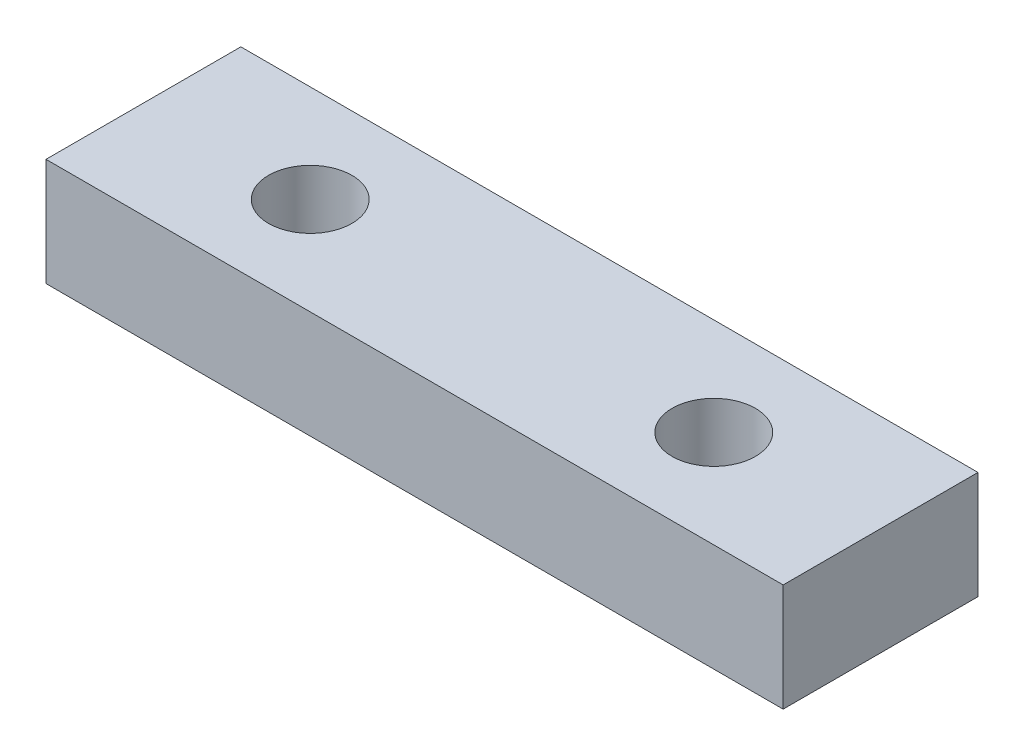
ISO-10303-21;
HEADER;
FILE_DESCRIPTION(('STEP AP214'),'2;1');
FILE_NAME('part.step','',(''),(''),'','','');
FILE_SCHEMA(('AUTOMOTIVE_DESIGN { 1 0 10303 214 1 1 1 1 }'));
ENDSEC;
DATA;
#1=APPLICATION_CONTEXT('core data for automotive mechanical design processes');
#2=APPLICATION_PROTOCOL_DEFINITION('international standard','automotive_design',2000,#1);
#3=PRODUCT_CONTEXT('',#1,'mechanical');
#4=PRODUCT('Part','Part','',(#3));
#5=PRODUCT_RELATED_PRODUCT_CATEGORY('part','',(#4));
#6=PRODUCT_DEFINITION_FORMATION('','',#4);
#7=PRODUCT_DEFINITION_CONTEXT('part definition',#1,'design');
#8=PRODUCT_DEFINITION('design','',#6,#7);
#9=PRODUCT_DEFINITION_SHAPE('','',#8);
#10=(LENGTH_UNIT() NAMED_UNIT(*) SI_UNIT(.MILLI.,.METRE.));
#11=(NAMED_UNIT(*) PLANE_ANGLE_UNIT() SI_UNIT($,.RADIAN.));
#12=(NAMED_UNIT(*) SI_UNIT($,.STERADIAN.) SOLID_ANGLE_UNIT());
#13=UNCERTAINTY_MEASURE_WITH_UNIT(LENGTH_MEASURE(1.E-05),#10,'distance_accuracy_value','');
#14=(GEOMETRIC_REPRESENTATION_CONTEXT(3) GLOBAL_UNCERTAINTY_ASSIGNED_CONTEXT((#13)) GLOBAL_UNIT_ASSIGNED_CONTEXT((#10,
#11,#12)) REPRESENTATION_CONTEXT('',''));
#15=CARTESIAN_POINT('',(0.,0.,0.));
#16=DIRECTION('',(0.,0.,1.));
#17=DIRECTION('',(1.,0.,0.));
#18=AXIS2_PLACEMENT_3D('',#15,#16,#17);
#19=CARTESIAN_POINT('',(0.,4.,0.));
#20=DIRECTION('',(0.,1.,0.));
#21=DIRECTION('',(0.,0.,1.));
#22=AXIS2_PLACEMENT_3D('',#19,#20,#21);
#23=PLANE('',#22);
#24=CARTESIAN_POINT('',(-7.5,4.,3.62125256427768));
#25=DIRECTION('',(0.,1.,0.));
#26=DIRECTION('',(0.,0.,1.));
#27=AXIS2_PLACEMENT_3D('',#24,#25,#26);
#28=CIRCLE('',#27,1.55);
#29=CARTESIAN_POINT('',(-7.5,4.,5.17125256427768));
#30=VERTEX_POINT('',#29);
#31=EDGE_CURVE('E131',#30,#30,#28,.T.);
#32=ORIENTED_EDGE('',*,*,#31,.F.);
#33=EDGE_LOOP('',(#32));
#34=FACE_BOUND('',#33,.T.);
#35=DIRECTION('',(0.,0.,1.));
#36=VECTOR('',#35,1.);
#37=CARTESIAN_POINT('',(-13.7000000000002,4.,0.));
#38=LINE('',#37,#36);
#39=CARTESIAN_POINT('',(-13.7000000000002,4.,0.));
#40=VERTEX_POINT('',#39);
#41=CARTESIAN_POINT('',(-13.7000000000002,4.,7.24250512855536));
#42=VERTEX_POINT('',#41);
#43=EDGE_CURVE('E115',#40,#42,#38,.T.);
#44=ORIENTED_EDGE('',*,*,#43,.T.);
#45=DIRECTION('',(1.,0.,0.));
#46=VECTOR('',#45,1.);
#47=CARTESIAN_POINT('',(-13.7000000000002,4.,7.24250512855536));
#48=LINE('',#47,#46);
#49=CARTESIAN_POINT('',(13.7000000000002,4.,7.24250512855535));
#50=VERTEX_POINT('',#49);
#51=EDGE_CURVE('E107',#42,#50,#48,.T.);
#52=ORIENTED_EDGE('',*,*,#51,.T.);
#53=DIRECTION('',(0.,0.,1.));
#54=VECTOR('',#53,1.);
#55=CARTESIAN_POINT('',(13.7000000000002,4.,0.));
#56=LINE('',#55,#54);
#57=CARTESIAN_POINT('',(13.7000000000002,4.,0.));
#58=VERTEX_POINT('',#57);
#59=EDGE_CURVE('E114',#58,#50,#56,.T.);
#60=ORIENTED_EDGE('',*,*,#59,.F.);
#61=DIRECTION('',(1.,0.,0.));
#62=VECTOR('',#61,1.);
#63=CARTESIAN_POINT('',(-13.7000000000002,4.,0.));
#64=LINE('',#63,#62);
#65=EDGE_CURVE('E124',#40,#58,#64,.T.);
#66=ORIENTED_EDGE('',*,*,#65,.F.);
#67=EDGE_LOOP('',(#44,#52,#60,#66));
#68=FACE_BOUND('',#67,.T.);
#69=CARTESIAN_POINT('',(7.5,4.,3.62125256427768));
#70=DIRECTION('',(0.,1.,0.));
#71=DIRECTION('',(0.,0.,1.));
#72=AXIS2_PLACEMENT_3D('',#69,#70,#71);
#73=CIRCLE('',#72,1.55);
#74=CARTESIAN_POINT('',(7.5,4.,5.17125256427768));
#75=VERTEX_POINT('',#74);
#76=EDGE_CURVE('E144',#75,#75,#73,.T.);
#77=ORIENTED_EDGE('',*,*,#76,.F.);
#78=EDGE_LOOP('',(#77));
#79=FACE_BOUND('',#78,.T.);
#80=ADVANCED_FACE('F65',(#34,#68,#79),#23,.T.);
#81=CARTESIAN_POINT('',(0.,0.,0.));
#82=DIRECTION('',(0.,1.,0.));
#83=DIRECTION('',(0.,0.,1.));
#84=AXIS2_PLACEMENT_3D('',#81,#82,#83);
#85=PLANE('',#84);
#86=CARTESIAN_POINT('',(-7.5,0.,3.62125256427768));
#87=DIRECTION('',(0.,1.,0.));
#88=DIRECTION('',(0.,0.,1.));
#89=AXIS2_PLACEMENT_3D('',#86,#87,#88);
#90=CIRCLE('',#89,1.55);
#91=CARTESIAN_POINT('',(-7.5,0.,5.17125256427768));
#92=VERTEX_POINT('',#91);
#93=EDGE_CURVE('E141',#92,#92,#90,.T.);
#94=ORIENTED_EDGE('',*,*,#93,.T.);
#95=EDGE_LOOP('',(#94));
#96=FACE_BOUND('',#95,.T.);
#97=DIRECTION('',(0.,0.,1.));
#98=VECTOR('',#97,1.);
#99=CARTESIAN_POINT('',(-13.7000000000002,0.,0.));
#100=LINE('',#99,#98);
#101=CARTESIAN_POINT('',(-13.7000000000002,0.,0.));
#102=VERTEX_POINT('',#101);
#103=CARTESIAN_POINT('',(-13.7000000000002,0.,7.24250512855536));
#104=VERTEX_POINT('',#103);
#105=EDGE_CURVE('E129',#102,#104,#100,.T.);
#106=ORIENTED_EDGE('',*,*,#105,.F.);
#107=DIRECTION('',(1.,0.,0.));
#108=VECTOR('',#107,1.);
#109=CARTESIAN_POINT('',(-13.7000000000002,0.,0.));
#110=LINE('',#109,#108);
#111=CARTESIAN_POINT('',(13.7000000000002,0.,0.));
#112=VERTEX_POINT('',#111);
#113=EDGE_CURVE('E135',#102,#112,#110,.T.);
#114=ORIENTED_EDGE('',*,*,#113,.T.);
#115=DIRECTION('',(0.,0.,1.));
#116=VECTOR('',#115,1.);
#117=CARTESIAN_POINT('',(13.7000000000002,0.,0.));
#118=LINE('',#117,#116);
#119=CARTESIAN_POINT('',(13.7000000000002,0.,7.24250512855535));
#120=VERTEX_POINT('',#119);
#121=EDGE_CURVE('E133',#112,#120,#118,.T.);
#122=ORIENTED_EDGE('',*,*,#121,.T.);
#123=DIRECTION('',(1.,0.,0.));
#124=VECTOR('',#123,1.);
#125=CARTESIAN_POINT('',(-13.7000000000002,0.,7.24250512855536));
#126=LINE('',#125,#124);
#127=EDGE_CURVE('E120',#104,#120,#126,.T.);
#128=ORIENTED_EDGE('',*,*,#127,.F.);
#129=EDGE_LOOP('',(#106,#114,#122,#128));
#130=FACE_BOUND('',#129,.T.);
#131=CARTESIAN_POINT('',(7.5,0.,3.62125256427768));
#132=DIRECTION('',(0.,1.,0.));
#133=DIRECTION('',(0.,0.,1.));
#134=AXIS2_PLACEMENT_3D('',#131,#132,#133);
#135=CIRCLE('',#134,1.55);
#136=CARTESIAN_POINT('',(7.5,0.,5.17125256427768));
#137=VERTEX_POINT('',#136);
#138=EDGE_CURVE('E147',#137,#137,#135,.T.);
#139=ORIENTED_EDGE('',*,*,#138,.T.);
#140=EDGE_LOOP('',(#139));
#141=FACE_BOUND('',#140,.T.);
#142=ADVANCED_FACE('F156',(#96,#130,#141),#85,.F.);
#143=CARTESIAN_POINT('',(-13.7000000000002,4.,0.));
#144=DIRECTION('',(1.,0.,0.));
#145=DIRECTION('',(0.,0.,-1.));
#146=AXIS2_PLACEMENT_3D('',#143,#144,#145);
#147=PLANE('',#146);
#148=ORIENTED_EDGE('',*,*,#105,.T.);
#149=DIRECTION('',(0.,-1.,0.));
#150=VECTOR('',#149,1.);
#151=CARTESIAN_POINT('',(-13.7000000000002,4.,7.24250512855536));
#152=LINE('',#151,#150);
#153=EDGE_CURVE('E12',#42,#104,#152,.T.);
#154=ORIENTED_EDGE('',*,*,#153,.F.);
#155=ORIENTED_EDGE('',*,*,#43,.F.);
#156=DIRECTION('',(0.,-1.,0.));
#157=VECTOR('',#156,1.);
#158=CARTESIAN_POINT('',(-13.7000000000002,4.,0.));
#159=LINE('',#158,#157);
#160=EDGE_CURVE('E82',#40,#102,#159,.T.);
#161=ORIENTED_EDGE('',*,*,#160,.T.);
#162=EDGE_LOOP('',(#148,#154,#155,#161));
#163=FACE_BOUND('',#162,.T.);
#164=ADVANCED_FACE('F67',(#163),#147,.F.);
#165=CARTESIAN_POINT('',(-13.7000000000002,4.,7.24250512855536));
#166=DIRECTION('',(0.,0.,-1.));
#167=DIRECTION('',(-1.,0.,0.));
#168=AXIS2_PLACEMENT_3D('',#165,#166,#167);
#169=PLANE('',#168);
#170=ORIENTED_EDGE('',*,*,#127,.T.);
#171=DIRECTION('',(0.,-1.,0.));
#172=VECTOR('',#171,1.);
#173=CARTESIAN_POINT('',(13.7000000000002,4.,7.24250512855535));
#174=LINE('',#173,#172);
#175=EDGE_CURVE('E74',#50,#120,#174,.T.);
#176=ORIENTED_EDGE('',*,*,#175,.F.);
#177=ORIENTED_EDGE('',*,*,#51,.F.);
#178=ORIENTED_EDGE('',*,*,#153,.T.);
#179=EDGE_LOOP('',(#170,#176,#177,#178));
#180=FACE_BOUND('',#179,.T.);
#181=ADVANCED_FACE('F119',(#180),#169,.F.);
#182=CARTESIAN_POINT('',(13.7000000000002,4.,0.));
#183=DIRECTION('',(1.,0.,0.));
#184=DIRECTION('',(0.,0.,-1.));
#185=AXIS2_PLACEMENT_3D('',#182,#183,#184);
#186=PLANE('',#185);
#187=ORIENTED_EDGE('',*,*,#121,.F.);
#188=DIRECTION('',(0.,-1.,0.));
#189=VECTOR('',#188,1.);
#190=CARTESIAN_POINT('',(13.7000000000002,4.,0.));
#191=LINE('',#190,#189);
#192=EDGE_CURVE('E96',#58,#112,#191,.T.);
#193=ORIENTED_EDGE('',*,*,#192,.F.);
#194=ORIENTED_EDGE('',*,*,#59,.T.);
#195=ORIENTED_EDGE('',*,*,#175,.T.);
#196=EDGE_LOOP('',(#187,#193,#194,#195));
#197=FACE_BOUND('',#196,.T.);
#198=ADVANCED_FACE('F123',(#197),#186,.T.);
#199=CARTESIAN_POINT('',(-13.7000000000002,4.,0.));
#200=DIRECTION('',(0.,0.,-1.));
#201=DIRECTION('',(-1.,0.,0.));
#202=AXIS2_PLACEMENT_3D('',#199,#200,#201);
#203=PLANE('',#202);
#204=ORIENTED_EDGE('',*,*,#113,.F.);
#205=ORIENTED_EDGE('',*,*,#160,.F.);
#206=ORIENTED_EDGE('',*,*,#65,.T.);
#207=ORIENTED_EDGE('',*,*,#192,.T.);
#208=EDGE_LOOP('',(#204,#205,#206,#207));
#209=FACE_BOUND('',#208,.T.);
#210=ADVANCED_FACE('F169',(#209),#203,.T.);
#211=CARTESIAN_POINT('',(-7.5,4.,3.62125256427768));
#212=DIRECTION('',(0.,-1.,0.));
#213=DIRECTION('',(0.,0.,-1.));
#214=AXIS2_PLACEMENT_3D('',#211,#212,#213);
#215=CYLINDRICAL_SURFACE('',#214,1.55);
#216=ORIENTED_EDGE('',*,*,#31,.T.);
#217=EDGE_LOOP('',(#216));
#218=FACE_BOUND('',#217,.T.);
#219=ORIENTED_EDGE('',*,*,#93,.F.);
#220=EDGE_LOOP('',(#219));
#221=FACE_BOUND('',#220,.T.);
#222=ADVANCED_FACE('F166',(#218,#221),#215,.F.);
#223=CARTESIAN_POINT('',(7.5,4.,3.62125256427768));
#224=DIRECTION('',(0.,-1.,0.));
#225=DIRECTION('',(0.,0.,-1.));
#226=AXIS2_PLACEMENT_3D('',#223,#224,#225);
#227=CYLINDRICAL_SURFACE('',#226,1.55);
#228=ORIENTED_EDGE('',*,*,#76,.T.);
#229=EDGE_LOOP('',(#228));
#230=FACE_BOUND('',#229,.T.);
#231=ORIENTED_EDGE('',*,*,#138,.F.);
#232=EDGE_LOOP('',(#231));
#233=FACE_BOUND('',#232,.T.);
#234=ADVANCED_FACE('F153',(#230,#233),#227,.F.);
#235=CLOSED_SHELL('',(#80,#142,#164,#181,#198,#210,#222,#234));
#236=MANIFOLD_SOLID_BREP('B2',#235);
#237=ADVANCED_BREP_SHAPE_REPRESENTATION('',(#18,#236),#14);
#238=SHAPE_DEFINITION_REPRESENTATION(#9,#237);
ENDSEC;
END-ISO-10303-21;
